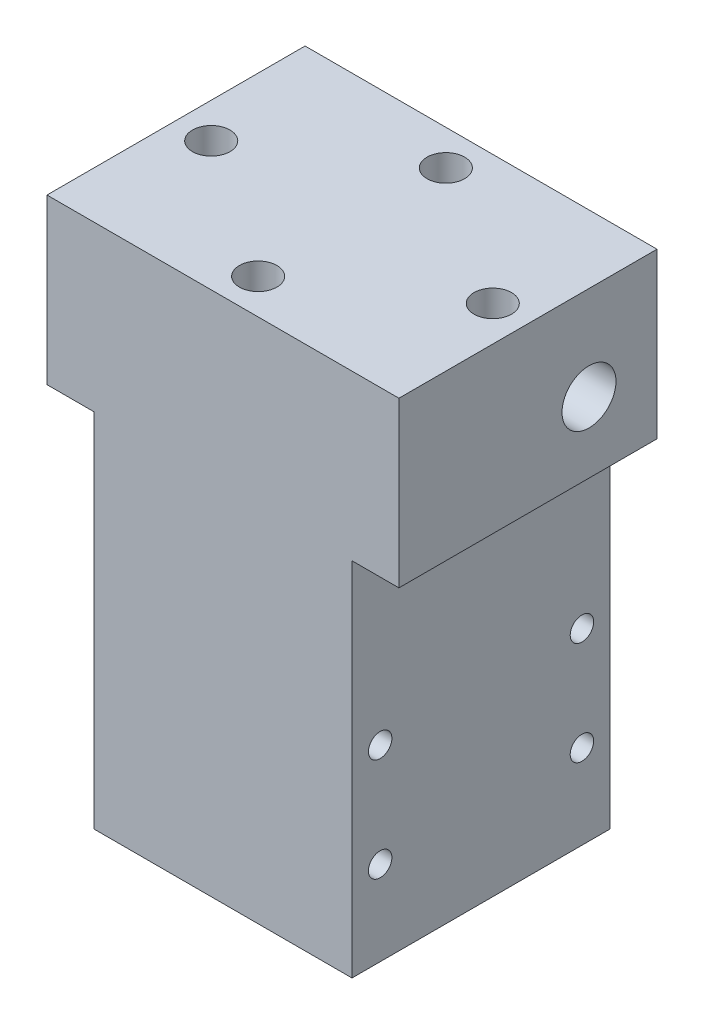
ISO-10303-21;
HEADER;
FILE_DESCRIPTION(('STEP AP214'),'2;1');
FILE_NAME('part.step','',(''),(''),'','','');
FILE_SCHEMA(('AUTOMOTIVE_DESIGN { 1 0 10303 214 1 1 1 1 }'));
ENDSEC;
DATA;
#1=APPLICATION_CONTEXT('core data for automotive mechanical design processes');
#2=APPLICATION_PROTOCOL_DEFINITION('international standard','automotive_design',2000,#1);
#3=PRODUCT_CONTEXT('',#1,'mechanical');
#4=PRODUCT('Part','Part','',(#3));
#5=PRODUCT_RELATED_PRODUCT_CATEGORY('part','',(#4));
#6=PRODUCT_DEFINITION_FORMATION('','',#4);
#7=PRODUCT_DEFINITION_CONTEXT('part definition',#1,'design');
#8=PRODUCT_DEFINITION('design','',#6,#7);
#9=PRODUCT_DEFINITION_SHAPE('','',#8);
#10=(LENGTH_UNIT() NAMED_UNIT(*) SI_UNIT(.MILLI.,.METRE.));
#11=(NAMED_UNIT(*) PLANE_ANGLE_UNIT() SI_UNIT($,.RADIAN.));
#12=(NAMED_UNIT(*) SI_UNIT($,.STERADIAN.) SOLID_ANGLE_UNIT());
#13=UNCERTAINTY_MEASURE_WITH_UNIT(LENGTH_MEASURE(1.E-05),#10,'distance_accuracy_value','');
#14=(GEOMETRIC_REPRESENTATION_CONTEXT(3) GLOBAL_UNCERTAINTY_ASSIGNED_CONTEXT((#13)) GLOBAL_UNIT_ASSIGNED_CONTEXT((#10,
#11,#12)) REPRESENTATION_CONTEXT('',''));
#15=CARTESIAN_POINT('',(0.,0.,0.));
#16=DIRECTION('',(0.,0.,1.));
#17=DIRECTION('',(1.,0.,0.));
#18=AXIS2_PLACEMENT_3D('',#15,#16,#17);
#19=CARTESIAN_POINT('',(37.5,-35.,-27.5));
#20=DIRECTION('',(1.,0.,0.));
#21=DIRECTION('',(0.,0.,-1.));
#22=AXIS2_PLACEMENT_3D('',#19,#20,#21);
#23=PLANE('',#22);
#24=CARTESIAN_POINT('',(37.5,-20.,-13.));
#25=DIRECTION('',(1.,0.,0.));
#26=DIRECTION('',(0.,0.,-1.));
#27=AXIS2_PLACEMENT_3D('',#24,#25,#26);
#28=CIRCLE('',#27,5.75);
#29=CARTESIAN_POINT('',(37.5,-20.,-18.75));
#30=VERTEX_POINT('',#29);
#31=EDGE_CURVE('E297',#30,#30,#28,.T.);
#32=ORIENTED_EDGE('',*,*,#31,.F.);
#33=EDGE_LOOP('',(#32));
#34=FACE_BOUND('',#33,.T.);
#35=DIRECTION('',(0.,0.,1.));
#36=VECTOR('',#35,1.);
#37=CARTESIAN_POINT('',(37.5,0.,-27.5));
#38=LINE('',#37,#36);
#39=CARTESIAN_POINT('',(37.5,0.,-27.5));
#40=VERTEX_POINT('',#39);
#41=CARTESIAN_POINT('',(37.5,0.,27.5));
#42=VERTEX_POINT('',#41);
#43=EDGE_CURVE('E36',#40,#42,#38,.T.);
#44=ORIENTED_EDGE('',*,*,#43,.T.);
#45=DIRECTION('',(0.,1.,0.));
#46=VECTOR('',#45,1.);
#47=CARTESIAN_POINT('',(37.5,-35.,27.5));
#48=LINE('',#47,#46);
#49=CARTESIAN_POINT('',(37.5,-35.,27.5));
#50=VERTEX_POINT('',#49);
#51=EDGE_CURVE('E97',#50,#42,#48,.T.);
#52=ORIENTED_EDGE('',*,*,#51,.F.);
#53=DIRECTION('',(0.,0.,1.));
#54=VECTOR('',#53,1.);
#55=CARTESIAN_POINT('',(37.5,-35.,-27.5));
#56=LINE('',#55,#54);
#57=CARTESIAN_POINT('',(37.5,-35.,-27.5));
#58=VERTEX_POINT('',#57);
#59=EDGE_CURVE('E11',#58,#50,#56,.T.);
#60=ORIENTED_EDGE('',*,*,#59,.F.);
#61=DIRECTION('',(0.,1.,0.));
#62=VECTOR('',#61,1.);
#63=CARTESIAN_POINT('',(37.5,-35.,-27.5));
#64=LINE('',#63,#62);
#65=EDGE_CURVE('E98',#58,#40,#64,.T.);
#66=ORIENTED_EDGE('',*,*,#65,.T.);
#67=EDGE_LOOP('',(#44,#52,#60,#66));
#68=FACE_BOUND('',#67,.T.);
#69=ADVANCED_FACE('F33',(#34,#68),#23,.T.);
#70=CARTESIAN_POINT('',(27.5,-35.,-27.5));
#71=DIRECTION('',(0.,-1.,0.));
#72=DIRECTION('',(0.,0.,-1.));
#73=AXIS2_PLACEMENT_3D('',#70,#71,#72);
#74=PLANE('',#73);
#75=ORIENTED_EDGE('',*,*,#59,.T.);
#76=DIRECTION('',(1.,0.,0.));
#77=VECTOR('',#76,1.);
#78=CARTESIAN_POINT('',(27.5,-35.,27.5));
#79=LINE('',#78,#77);
#80=CARTESIAN_POINT('',(27.5,-35.,27.5));
#81=VERTEX_POINT('',#80);
#82=EDGE_CURVE('E115',#81,#50,#79,.T.);
#83=ORIENTED_EDGE('',*,*,#82,.F.);
#84=DIRECTION('',(0.,0.,1.));
#85=VECTOR('',#84,1.);
#86=CARTESIAN_POINT('',(27.5,-35.,-27.5));
#87=LINE('',#86,#85);
#88=CARTESIAN_POINT('',(27.5,-35.,-27.5));
#89=VERTEX_POINT('',#88);
#90=EDGE_CURVE('E41',#89,#81,#87,.T.);
#91=ORIENTED_EDGE('',*,*,#90,.F.);
#92=DIRECTION('',(1.,0.,0.));
#93=VECTOR('',#92,1.);
#94=CARTESIAN_POINT('',(27.5,-35.,-27.5));
#95=LINE('',#94,#93);
#96=EDGE_CURVE('E103',#89,#58,#95,.T.);
#97=ORIENTED_EDGE('',*,*,#96,.T.);
#98=EDGE_LOOP('',(#75,#83,#91,#97));
#99=FACE_BOUND('',#98,.T.);
#100=ADVANCED_FACE('F184',(#99),#74,.T.);
#101=CARTESIAN_POINT('',(27.5,-112.,-27.5));
#102=DIRECTION('',(1.,0.,0.));
#103=DIRECTION('',(0.,1.,0.));
#104=AXIS2_PLACEMENT_3D('',#101,#102,#103);
#105=PLANE('',#104);
#106=CARTESIAN_POINT('',(27.5,-94.,-21.5));
#107=DIRECTION('',(1.,0.,0.));
#108=DIRECTION('',(0.,1.,0.));
#109=AXIS2_PLACEMENT_3D('',#106,#107,#108);
#110=CIRCLE('',#109,2.5);
#111=CARTESIAN_POINT('',(27.5,-91.5,-21.5));
#112=VERTEX_POINT('',#111);
#113=EDGE_CURVE('E261',#112,#112,#110,.T.);
#114=ORIENTED_EDGE('',*,*,#113,.F.);
#115=EDGE_LOOP('',(#114));
#116=FACE_BOUND('',#115,.T.);
#117=CARTESIAN_POINT('',(27.5,-72.,-21.5));
#118=DIRECTION('',(1.,0.,0.));
#119=DIRECTION('',(0.,1.,0.));
#120=AXIS2_PLACEMENT_3D('',#117,#118,#119);
#121=CIRCLE('',#120,2.5);
#122=CARTESIAN_POINT('',(27.5,-69.5,-21.5));
#123=VERTEX_POINT('',#122);
#124=EDGE_CURVE('E255',#123,#123,#121,.T.);
#125=ORIENTED_EDGE('',*,*,#124,.F.);
#126=EDGE_LOOP('',(#125));
#127=FACE_BOUND('',#126,.T.);
#128=CARTESIAN_POINT('',(27.5,-72.,21.5));
#129=DIRECTION('',(1.,0.,0.));
#130=DIRECTION('',(0.,1.,0.));
#131=AXIS2_PLACEMENT_3D('',#128,#129,#130);
#132=CIRCLE('',#131,2.5);
#133=CARTESIAN_POINT('',(27.5,-69.5,21.5));
#134=VERTEX_POINT('',#133);
#135=EDGE_CURVE('E249',#134,#134,#132,.T.);
#136=ORIENTED_EDGE('',*,*,#135,.F.);
#137=EDGE_LOOP('',(#136));
#138=FACE_BOUND('',#137,.T.);
#139=CARTESIAN_POINT('',(27.5,-94.,21.5));
#140=DIRECTION('',(1.,0.,0.));
#141=DIRECTION('',(0.,1.,0.));
#142=AXIS2_PLACEMENT_3D('',#139,#140,#141);
#143=CIRCLE('',#142,2.5);
#144=CARTESIAN_POINT('',(27.5,-91.5,21.5));
#145=VERTEX_POINT('',#144);
#146=EDGE_CURVE('E243',#145,#145,#143,.T.);
#147=ORIENTED_EDGE('',*,*,#146,.F.);
#148=EDGE_LOOP('',(#147));
#149=FACE_BOUND('',#148,.T.);
#150=ORIENTED_EDGE('',*,*,#90,.T.);
#151=DIRECTION('',(0.,1.,0.));
#152=VECTOR('',#151,1.);
#153=CARTESIAN_POINT('',(27.5,-112.,27.5));
#154=LINE('',#153,#152);
#155=CARTESIAN_POINT('',(27.5,-112.,27.5));
#156=VERTEX_POINT('',#155);
#157=EDGE_CURVE('E133',#156,#81,#154,.T.);
#158=ORIENTED_EDGE('',*,*,#157,.F.);
#159=DIRECTION('',(0.,0.,1.));
#160=VECTOR('',#159,1.);
#161=CARTESIAN_POINT('',(27.5,-112.,-27.5));
#162=LINE('',#161,#160);
#163=CARTESIAN_POINT('',(27.5,-112.,-27.5));
#164=VERTEX_POINT('',#163);
#165=EDGE_CURVE('E155',#164,#156,#162,.T.);
#166=ORIENTED_EDGE('',*,*,#165,.F.);
#167=DIRECTION('',(0.,1.,0.));
#168=VECTOR('',#167,1.);
#169=CARTESIAN_POINT('',(27.5,-112.,-27.5));
#170=LINE('',#169,#168);
#171=EDGE_CURVE('E151',#164,#89,#170,.T.);
#172=ORIENTED_EDGE('',*,*,#171,.T.);
#173=EDGE_LOOP('',(#150,#158,#166,#172));
#174=FACE_BOUND('',#173,.T.);
#175=ADVANCED_FACE('F183',(#116,#127,#138,#149,#174),#105,.T.);
#176=CARTESIAN_POINT('',(-27.5,-112.,-27.5));
#177=DIRECTION('',(0.,-1.,0.));
#178=DIRECTION('',(0.,0.,-1.));
#179=AXIS2_PLACEMENT_3D('',#176,#177,#178);
#180=PLANE('',#179);
#181=CARTESIAN_POINT('',(0.,-112.,0.));
#182=DIRECTION('',(0.,-1.,0.));
#183=DIRECTION('',(0.,0.,-1.));
#184=AXIS2_PLACEMENT_3D('',#181,#182,#183);
#185=CIRCLE('',#184,11.);
#186=CARTESIAN_POINT('',(0.,-112.,-11.));
#187=VERTEX_POINT('',#186);
#188=EDGE_CURVE('E291',#187,#187,#185,.T.);
#189=ORIENTED_EDGE('',*,*,#188,.F.);
#190=EDGE_LOOP('',(#189));
#191=FACE_BOUND('',#190,.T.);
#192=ORIENTED_EDGE('',*,*,#165,.T.);
#193=DIRECTION('',(1.,0.,0.));
#194=VECTOR('',#193,1.);
#195=CARTESIAN_POINT('',(-27.5,-112.,27.5));
#196=LINE('',#195,#194);
#197=CARTESIAN_POINT('',(-27.5,-112.,27.5));
#198=VERTEX_POINT('',#197);
#199=EDGE_CURVE('E130',#198,#156,#196,.T.);
#200=ORIENTED_EDGE('',*,*,#199,.F.);
#201=DIRECTION('',(0.,0.,1.));
#202=VECTOR('',#201,1.);
#203=CARTESIAN_POINT('',(-27.5,-112.,-27.5));
#204=LINE('',#203,#202);
#205=CARTESIAN_POINT('',(-27.5,-112.,-27.5));
#206=VERTEX_POINT('',#205);
#207=EDGE_CURVE('E157',#206,#198,#204,.T.);
#208=ORIENTED_EDGE('',*,*,#207,.F.);
#209=DIRECTION('',(1.,0.,0.));
#210=VECTOR('',#209,1.);
#211=CARTESIAN_POINT('',(-27.5,-112.,-27.5));
#212=LINE('',#211,#210);
#213=EDGE_CURVE('E148',#206,#164,#212,.T.);
#214=ORIENTED_EDGE('',*,*,#213,.T.);
#215=EDGE_LOOP('',(#192,#200,#208,#214));
#216=FACE_BOUND('',#215,.T.);
#217=ADVANCED_FACE('F179',(#191,#216),#180,.T.);
#218=CARTESIAN_POINT('',(-27.5,-35.,-27.5));
#219=DIRECTION('',(-1.,0.,0.));
#220=DIRECTION('',(0.,-1.,0.));
#221=AXIS2_PLACEMENT_3D('',#218,#219,#220);
#222=PLANE('',#221);
#223=CARTESIAN_POINT('',(-27.5,-94.,21.5));
#224=DIRECTION('',(-1.,0.,0.));
#225=DIRECTION('',(0.,-1.,0.));
#226=AXIS2_PLACEMENT_3D('',#223,#224,#225);
#227=CIRCLE('',#226,2.5);
#228=CARTESIAN_POINT('',(-27.5,-96.5,21.5));
#229=VERTEX_POINT('',#228);
#230=EDGE_CURVE('E285',#229,#229,#227,.T.);
#231=ORIENTED_EDGE('',*,*,#230,.F.);
#232=EDGE_LOOP('',(#231));
#233=FACE_BOUND('',#232,.T.);
#234=CARTESIAN_POINT('',(-27.5,-72.,21.5));
#235=DIRECTION('',(-1.,0.,0.));
#236=DIRECTION('',(0.,-1.,0.));
#237=AXIS2_PLACEMENT_3D('',#234,#235,#236);
#238=CIRCLE('',#237,2.5);
#239=CARTESIAN_POINT('',(-27.5,-74.5,21.5));
#240=VERTEX_POINT('',#239);
#241=EDGE_CURVE('E279',#240,#240,#238,.T.);
#242=ORIENTED_EDGE('',*,*,#241,.F.);
#243=EDGE_LOOP('',(#242));
#244=FACE_BOUND('',#243,.T.);
#245=CARTESIAN_POINT('',(-27.5,-72.,-21.5));
#246=DIRECTION('',(-1.,0.,0.));
#247=DIRECTION('',(0.,-1.,0.));
#248=AXIS2_PLACEMENT_3D('',#245,#246,#247);
#249=CIRCLE('',#248,2.5);
#250=CARTESIAN_POINT('',(-27.5,-74.5,-21.5));
#251=VERTEX_POINT('',#250);
#252=EDGE_CURVE('E273',#251,#251,#249,.T.);
#253=ORIENTED_EDGE('',*,*,#252,.F.);
#254=EDGE_LOOP('',(#253));
#255=FACE_BOUND('',#254,.T.);
#256=CARTESIAN_POINT('',(-27.5,-94.,-21.5));
#257=DIRECTION('',(-1.,0.,0.));
#258=DIRECTION('',(0.,-1.,0.));
#259=AXIS2_PLACEMENT_3D('',#256,#257,#258);
#260=CIRCLE('',#259,2.5);
#261=CARTESIAN_POINT('',(-27.5,-96.5,-21.5));
#262=VERTEX_POINT('',#261);
#263=EDGE_CURVE('E267',#262,#262,#260,.T.);
#264=ORIENTED_EDGE('',*,*,#263,.F.);
#265=EDGE_LOOP('',(#264));
#266=FACE_BOUND('',#265,.T.);
#267=ORIENTED_EDGE('',*,*,#207,.T.);
#268=DIRECTION('',(0.,-1.,0.));
#269=VECTOR('',#268,1.);
#270=CARTESIAN_POINT('',(-27.5,-35.,27.5));
#271=LINE('',#270,#269);
#272=CARTESIAN_POINT('',(-27.5,-35.,27.5));
#273=VERTEX_POINT('',#272);
#274=EDGE_CURVE('E127',#273,#198,#271,.T.);
#275=ORIENTED_EDGE('',*,*,#274,.F.);
#276=DIRECTION('',(0.,0.,1.));
#277=VECTOR('',#276,1.);
#278=CARTESIAN_POINT('',(-27.5,-35.,-27.5));
#279=LINE('',#278,#277);
#280=CARTESIAN_POINT('',(-27.5,-35.,-27.5));
#281=VERTEX_POINT('',#280);
#282=EDGE_CURVE('E159',#281,#273,#279,.T.);
#283=ORIENTED_EDGE('',*,*,#282,.F.);
#284=DIRECTION('',(0.,-1.,0.));
#285=VECTOR('',#284,1.);
#286=CARTESIAN_POINT('',(-27.5,-35.,-27.5));
#287=LINE('',#286,#285);
#288=EDGE_CURVE('E145',#281,#206,#287,.T.);
#289=ORIENTED_EDGE('',*,*,#288,.T.);
#290=EDGE_LOOP('',(#267,#275,#283,#289));
#291=FACE_BOUND('',#290,.T.);
#292=ADVANCED_FACE('F172',(#233,#244,#255,#266,#291),#222,.T.);
#293=CARTESIAN_POINT('',(-37.5,-35.,-27.5));
#294=DIRECTION('',(0.,-1.,0.));
#295=DIRECTION('',(0.,0.,-1.));
#296=AXIS2_PLACEMENT_3D('',#293,#294,#295);
#297=PLANE('',#296);
#298=ORIENTED_EDGE('',*,*,#282,.T.);
#299=DIRECTION('',(1.,0.,0.));
#300=VECTOR('',#299,1.);
#301=CARTESIAN_POINT('',(-37.5,-35.,27.5));
#302=LINE('',#301,#300);
#303=CARTESIAN_POINT('',(-37.5,-35.,27.5));
#304=VERTEX_POINT('',#303);
#305=EDGE_CURVE('E124',#304,#273,#302,.T.);
#306=ORIENTED_EDGE('',*,*,#305,.F.);
#307=DIRECTION('',(0.,0.,1.));
#308=VECTOR('',#307,1.);
#309=CARTESIAN_POINT('',(-37.5,-35.,-27.5));
#310=LINE('',#309,#308);
#311=CARTESIAN_POINT('',(-37.5,-35.,-27.5));
#312=VERTEX_POINT('',#311);
#313=EDGE_CURVE('E161',#312,#304,#310,.T.);
#314=ORIENTED_EDGE('',*,*,#313,.F.);
#315=DIRECTION('',(1.,0.,0.));
#316=VECTOR('',#315,1.);
#317=CARTESIAN_POINT('',(-37.5,-35.,-27.5));
#318=LINE('',#317,#316);
#319=EDGE_CURVE('E142',#312,#281,#318,.T.);
#320=ORIENTED_EDGE('',*,*,#319,.T.);
#321=EDGE_LOOP('',(#298,#306,#314,#320));
#322=FACE_BOUND('',#321,.T.);
#323=ADVANCED_FACE('F169',(#322),#297,.T.);
#324=CARTESIAN_POINT('',(-37.5,0.,-27.5));
#325=DIRECTION('',(-1.,0.,0.));
#326=DIRECTION('',(0.,0.,1.));
#327=AXIS2_PLACEMENT_3D('',#324,#325,#326);
#328=PLANE('',#327);
#329=CARTESIAN_POINT('',(-37.5,-20.,-13.));
#330=DIRECTION('',(-1.,0.,0.));
#331=DIRECTION('',(0.,0.,1.));
#332=AXIS2_PLACEMENT_3D('',#329,#330,#331);
#333=CIRCLE('',#332,5.75);
#334=CARTESIAN_POINT('',(-37.5,-20.,-7.25));
#335=VERTEX_POINT('',#334);
#336=EDGE_CURVE('E303',#335,#335,#333,.T.);
#337=ORIENTED_EDGE('',*,*,#336,.F.);
#338=EDGE_LOOP('',(#337));
#339=FACE_BOUND('',#338,.T.);
#340=ORIENTED_EDGE('',*,*,#313,.T.);
#341=DIRECTION('',(0.,-1.,0.));
#342=VECTOR('',#341,1.);
#343=CARTESIAN_POINT('',(-37.5,0.,27.5));
#344=LINE('',#343,#342);
#345=CARTESIAN_POINT('',(-37.5,0.,27.5));
#346=VERTEX_POINT('',#345);
#347=EDGE_CURVE('E110',#346,#304,#344,.T.);
#348=ORIENTED_EDGE('',*,*,#347,.F.);
#349=DIRECTION('',(0.,0.,1.));
#350=VECTOR('',#349,1.);
#351=CARTESIAN_POINT('',(-37.5,0.,-27.5));
#352=LINE('',#351,#350);
#353=CARTESIAN_POINT('',(-37.5,0.,-27.5));
#354=VERTEX_POINT('',#353);
#355=EDGE_CURVE('E102',#354,#346,#352,.T.);
#356=ORIENTED_EDGE('',*,*,#355,.F.);
#357=DIRECTION('',(0.,-1.,0.));
#358=VECTOR('',#357,1.);
#359=CARTESIAN_POINT('',(-37.5,0.,-27.5));
#360=LINE('',#359,#358);
#361=EDGE_CURVE('E139',#354,#312,#360,.T.);
#362=ORIENTED_EDGE('',*,*,#361,.T.);
#363=EDGE_LOOP('',(#340,#348,#356,#362));
#364=FACE_BOUND('',#363,.T.);
#365=ADVANCED_FACE('F163',(#339,#364),#328,.T.);
#366=CARTESIAN_POINT('',(37.5,0.,-27.5));
#367=DIRECTION('',(0.,1.,0.));
#368=DIRECTION('',(-1.,0.,0.));
#369=AXIS2_PLACEMENT_3D('',#366,#367,#368);
#370=PLANE('',#369);
#371=CARTESIAN_POINT('',(0.,0.,20.));
#372=DIRECTION('',(0.,1.,0.));
#373=DIRECTION('',(-1.,0.,0.));
#374=AXIS2_PLACEMENT_3D('',#371,#372,#373);
#375=CIRCLE('',#374,4.);
#376=CARTESIAN_POINT('',(-4.,0.,20.));
#377=VERTEX_POINT('',#376);
#378=EDGE_CURVE('E215',#377,#377,#375,.T.);
#379=ORIENTED_EDGE('',*,*,#378,.F.);
#380=EDGE_LOOP('',(#379));
#381=FACE_BOUND('',#380,.T.);
#382=CARTESIAN_POINT('',(30.,0.,0.));
#383=DIRECTION('',(0.,1.,0.));
#384=DIRECTION('',(-1.,0.,0.));
#385=AXIS2_PLACEMENT_3D('',#382,#383,#384);
#386=CIRCLE('',#385,4.00000000000001);
#387=CARTESIAN_POINT('',(26.,0.,0.));
#388=VERTEX_POINT('',#387);
#389=EDGE_CURVE('E219',#388,#388,#386,.T.);
#390=ORIENTED_EDGE('',*,*,#389,.F.);
#391=EDGE_LOOP('',(#390));
#392=FACE_BOUND('',#391,.T.);
#393=CARTESIAN_POINT('',(0.,0.,-20.));
#394=DIRECTION('',(0.,1.,0.));
#395=DIRECTION('',(-1.,0.,0.));
#396=AXIS2_PLACEMENT_3D('',#393,#394,#395);
#397=CIRCLE('',#396,4.);
#398=CARTESIAN_POINT('',(-4.,0.,-20.));
#399=VERTEX_POINT('',#398);
#400=EDGE_CURVE('E223',#399,#399,#397,.T.);
#401=ORIENTED_EDGE('',*,*,#400,.F.);
#402=EDGE_LOOP('',(#401));
#403=FACE_BOUND('',#402,.T.);
#404=CARTESIAN_POINT('',(-30.,0.,0.));
#405=DIRECTION('',(0.,1.,0.));
#406=DIRECTION('',(-1.,0.,0.));
#407=AXIS2_PLACEMENT_3D('',#404,#405,#406);
#408=CIRCLE('',#407,4.);
#409=CARTESIAN_POINT('',(-34.,0.,0.));
#410=VERTEX_POINT('',#409);
#411=EDGE_CURVE('E119',#410,#410,#408,.T.);
#412=ORIENTED_EDGE('',*,*,#411,.F.);
#413=EDGE_LOOP('',(#412));
#414=FACE_BOUND('',#413,.T.);
#415=ORIENTED_EDGE('',*,*,#355,.T.);
#416=DIRECTION('',(-1.,0.,0.));
#417=VECTOR('',#416,1.);
#418=CARTESIAN_POINT('',(37.5,0.,27.5));
#419=LINE('',#418,#417);
#420=EDGE_CURVE('E105',#42,#346,#419,.T.);
#421=ORIENTED_EDGE('',*,*,#420,.F.);
#422=ORIENTED_EDGE('',*,*,#43,.F.);
#423=DIRECTION('',(-1.,0.,0.));
#424=VECTOR('',#423,1.);
#425=CARTESIAN_POINT('',(37.5,0.,-27.5));
#426=LINE('',#425,#424);
#427=EDGE_CURVE('E137',#40,#354,#426,.T.);
#428=ORIENTED_EDGE('',*,*,#427,.T.);
#429=EDGE_LOOP('',(#415,#421,#422,#428));
#430=FACE_BOUND('',#429,.T.);
#431=ADVANCED_FACE('F106',(#381,#392,#403,#414,#430),#370,.T.);
#432=CARTESIAN_POINT('',(0.,0.,-27.5));
#433=DIRECTION('',(0.,0.,1.));
#434=DIRECTION('',(1.,0.,0.));
#435=AXIS2_PLACEMENT_3D('',#432,#433,#434);
#436=PLANE('',#435);
#437=ORIENTED_EDGE('',*,*,#65,.F.);
#438=ORIENTED_EDGE('',*,*,#96,.F.);
#439=ORIENTED_EDGE('',*,*,#171,.F.);
#440=ORIENTED_EDGE('',*,*,#213,.F.);
#441=ORIENTED_EDGE('',*,*,#288,.F.);
#442=ORIENTED_EDGE('',*,*,#319,.F.);
#443=ORIENTED_EDGE('',*,*,#361,.F.);
#444=ORIENTED_EDGE('',*,*,#427,.F.);
#445=EDGE_LOOP('',(#437,#438,#439,#440,#441,#442,#443,#444));
#446=FACE_BOUND('',#445,.T.);
#447=ADVANCED_FACE('F175',(#446),#436,.F.);
#448=CARTESIAN_POINT('',(0.,0.,27.5));
#449=DIRECTION('',(0.,0.,1.));
#450=DIRECTION('',(1.,0.,0.));
#451=AXIS2_PLACEMENT_3D('',#448,#449,#450);
#452=PLANE('',#451);
#453=ORIENTED_EDGE('',*,*,#51,.T.);
#454=ORIENTED_EDGE('',*,*,#420,.T.);
#455=ORIENTED_EDGE('',*,*,#347,.T.);
#456=ORIENTED_EDGE('',*,*,#305,.T.);
#457=ORIENTED_EDGE('',*,*,#274,.T.);
#458=ORIENTED_EDGE('',*,*,#199,.T.);
#459=ORIENTED_EDGE('',*,*,#157,.T.);
#460=ORIENTED_EDGE('',*,*,#82,.T.);
#461=EDGE_LOOP('',(#453,#454,#455,#456,#457,#458,#459,#460));
#462=FACE_BOUND('',#461,.T.);
#463=ADVANCED_FACE('F113',(#462),#452,.T.);
#464=CARTESIAN_POINT('',(-30.,-30.,0.));
#465=DIRECTION('',(0.,1.,0.));
#466=DIRECTION('',(-1.,0.,0.));
#467=AXIS2_PLACEMENT_3D('',#464,#465,#466);
#468=CYLINDRICAL_SURFACE('',#467,4.);
#469=CARTESIAN_POINT('',(-30.,-30.,0.));
#470=DIRECTION('',(0.,1.,0.));
#471=DIRECTION('',(-1.,0.,0.));
#472=AXIS2_PLACEMENT_3D('',#469,#470,#471);
#473=CIRCLE('',#472,4.);
#474=CARTESIAN_POINT('',(-34.,-30.,0.));
#475=VERTEX_POINT('',#474);
#476=EDGE_CURVE('E116',#475,#475,#473,.T.);
#477=ORIENTED_EDGE('',*,*,#476,.F.);
#478=EDGE_LOOP('',(#477));
#479=FACE_BOUND('',#478,.T.);
#480=ORIENTED_EDGE('',*,*,#411,.T.);
#481=EDGE_LOOP('',(#480));
#482=FACE_BOUND('',#481,.T.);
#483=ADVANCED_FACE('F430',(#479,#482),#468,.F.);
#484=CARTESIAN_POINT('',(-30.,-30.,0.));
#485=DIRECTION('',(0.,1.,0.));
#486=DIRECTION('',(-1.,0.,0.));
#487=AXIS2_PLACEMENT_3D('',#484,#485,#486);
#488=PLANE('',#487);
#489=ORIENTED_EDGE('',*,*,#476,.T.);
#490=EDGE_LOOP('',(#489));
#491=FACE_BOUND('',#490,.T.);
#492=ADVANCED_FACE('F426',(#491),#488,.T.);
#493=CARTESIAN_POINT('',(0.,-30.,-20.));
#494=DIRECTION('',(0.,1.,0.));
#495=DIRECTION('',(-1.,0.,0.));
#496=AXIS2_PLACEMENT_3D('',#493,#494,#495);
#497=CYLINDRICAL_SURFACE('',#496,4.);
#498=CARTESIAN_POINT('',(0.,-30.,-20.));
#499=DIRECTION('',(0.,1.,0.));
#500=DIRECTION('',(-1.,0.,0.));
#501=AXIS2_PLACEMENT_3D('',#498,#499,#500);
#502=CIRCLE('',#501,4.);
#503=CARTESIAN_POINT('',(-4.,-30.,-20.));
#504=VERTEX_POINT('',#503);
#505=EDGE_CURVE('E227',#504,#504,#502,.T.);
#506=ORIENTED_EDGE('',*,*,#505,.F.);
#507=EDGE_LOOP('',(#506));
#508=FACE_BOUND('',#507,.T.);
#509=ORIENTED_EDGE('',*,*,#400,.T.);
#510=EDGE_LOOP('',(#509));
#511=FACE_BOUND('',#510,.T.);
#512=ADVANCED_FACE('F423',(#508,#511),#497,.F.);
#513=CARTESIAN_POINT('',(0.,-30.,-20.));
#514=DIRECTION('',(0.,1.,0.));
#515=DIRECTION('',(-1.,0.,0.));
#516=AXIS2_PLACEMENT_3D('',#513,#514,#515);
#517=PLANE('',#516);
#518=ORIENTED_EDGE('',*,*,#505,.T.);
#519=EDGE_LOOP('',(#518));
#520=FACE_BOUND('',#519,.T.);
#521=ADVANCED_FACE('F419',(#520),#517,.T.);
#522=CARTESIAN_POINT('',(30.,-30.,0.));
#523=DIRECTION('',(0.,1.,0.));
#524=DIRECTION('',(-1.,0.,0.));
#525=AXIS2_PLACEMENT_3D('',#522,#523,#524);
#526=CYLINDRICAL_SURFACE('',#525,4.00000000000001);
#527=CARTESIAN_POINT('',(30.,-30.,0.));
#528=DIRECTION('',(0.,1.,0.));
#529=DIRECTION('',(-1.,0.,0.));
#530=AXIS2_PLACEMENT_3D('',#527,#528,#529);
#531=CIRCLE('',#530,4.00000000000001);
#532=CARTESIAN_POINT('',(26.,-30.,0.));
#533=VERTEX_POINT('',#532);
#534=EDGE_CURVE('E232',#533,#533,#531,.T.);
#535=ORIENTED_EDGE('',*,*,#534,.F.);
#536=EDGE_LOOP('',(#535));
#537=FACE_BOUND('',#536,.T.);
#538=ORIENTED_EDGE('',*,*,#389,.T.);
#539=EDGE_LOOP('',(#538));
#540=FACE_BOUND('',#539,.T.);
#541=ADVANCED_FACE('F415',(#537,#540),#526,.F.);
#542=CARTESIAN_POINT('',(30.,-30.,0.));
#543=DIRECTION('',(0.,1.,0.));
#544=DIRECTION('',(-1.,0.,0.));
#545=AXIS2_PLACEMENT_3D('',#542,#543,#544);
#546=PLANE('',#545);
#547=ORIENTED_EDGE('',*,*,#534,.T.);
#548=EDGE_LOOP('',(#547));
#549=FACE_BOUND('',#548,.T.);
#550=ADVANCED_FACE('F411',(#549),#546,.T.);
#551=CARTESIAN_POINT('',(0.,-30.,20.));
#552=DIRECTION('',(0.,1.,0.));
#553=DIRECTION('',(-1.,0.,0.));
#554=AXIS2_PLACEMENT_3D('',#551,#552,#553);
#555=CYLINDRICAL_SURFACE('',#554,4.);
#556=CARTESIAN_POINT('',(0.,-30.,20.));
#557=DIRECTION('',(0.,1.,0.));
#558=DIRECTION('',(-1.,0.,0.));
#559=AXIS2_PLACEMENT_3D('',#556,#557,#558);
#560=CIRCLE('',#559,4.);
#561=CARTESIAN_POINT('',(-4.,-30.,20.));
#562=VERTEX_POINT('',#561);
#563=EDGE_CURVE('E236',#562,#562,#560,.T.);
#564=ORIENTED_EDGE('',*,*,#563,.F.);
#565=EDGE_LOOP('',(#564));
#566=FACE_BOUND('',#565,.T.);
#567=ORIENTED_EDGE('',*,*,#378,.T.);
#568=EDGE_LOOP('',(#567));
#569=FACE_BOUND('',#568,.T.);
#570=ADVANCED_FACE('F407',(#566,#569),#555,.F.);
#571=CARTESIAN_POINT('',(0.,-30.,20.));
#572=DIRECTION('',(0.,1.,0.));
#573=DIRECTION('',(-1.,0.,0.));
#574=AXIS2_PLACEMENT_3D('',#571,#572,#573);
#575=PLANE('',#574);
#576=ORIENTED_EDGE('',*,*,#563,.T.);
#577=EDGE_LOOP('',(#576));
#578=FACE_BOUND('',#577,.T.);
#579=ADVANCED_FACE('F403',(#578),#575,.T.);
#580=CARTESIAN_POINT('',(5.50000000000001,-94.,21.5));
#581=DIRECTION('',(1.,0.,0.));
#582=DIRECTION('',(0.,1.,0.));
#583=AXIS2_PLACEMENT_3D('',#580,#581,#582);
#584=CYLINDRICAL_SURFACE('',#583,2.5);
#585=CARTESIAN_POINT('',(5.50000000000001,-94.,21.5));
#586=DIRECTION('',(1.,0.,0.));
#587=DIRECTION('',(0.,1.,0.));
#588=AXIS2_PLACEMENT_3D('',#585,#586,#587);
#589=CIRCLE('',#588,2.5);
#590=CARTESIAN_POINT('',(5.50000000000001,-91.5,21.5));
#591=VERTEX_POINT('',#590);
#592=EDGE_CURVE('E240',#591,#591,#589,.T.);
#593=ORIENTED_EDGE('',*,*,#592,.F.);
#594=EDGE_LOOP('',(#593));
#595=FACE_BOUND('',#594,.T.);
#596=ORIENTED_EDGE('',*,*,#146,.T.);
#597=EDGE_LOOP('',(#596));
#598=FACE_BOUND('',#597,.T.);
#599=ADVANCED_FACE('F399',(#595,#598),#584,.F.);
#600=CARTESIAN_POINT('',(5.50000000000001,-94.,21.5));
#601=DIRECTION('',(1.,0.,0.));
#602=DIRECTION('',(0.,1.,0.));
#603=AXIS2_PLACEMENT_3D('',#600,#601,#602);
#604=PLANE('',#603);
#605=ORIENTED_EDGE('',*,*,#592,.T.);
#606=EDGE_LOOP('',(#605));
#607=FACE_BOUND('',#606,.T.);
#608=ADVANCED_FACE('F395',(#607),#604,.T.);
#609=CARTESIAN_POINT('',(5.50000000000001,-72.,21.5));
#610=DIRECTION('',(1.,0.,0.));
#611=DIRECTION('',(0.,1.,0.));
#612=AXIS2_PLACEMENT_3D('',#609,#610,#611);
#613=CYLINDRICAL_SURFACE('',#612,2.5);
#614=CARTESIAN_POINT('',(5.50000000000001,-72.,21.5));
#615=DIRECTION('',(1.,0.,0.));
#616=DIRECTION('',(0.,1.,0.));
#617=AXIS2_PLACEMENT_3D('',#614,#615,#616);
#618=CIRCLE('',#617,2.5);
#619=CARTESIAN_POINT('',(5.50000000000001,-69.5,21.5));
#620=VERTEX_POINT('',#619);
#621=EDGE_CURVE('E246',#620,#620,#618,.T.);
#622=ORIENTED_EDGE('',*,*,#621,.F.);
#623=EDGE_LOOP('',(#622));
#624=FACE_BOUND('',#623,.T.);
#625=ORIENTED_EDGE('',*,*,#135,.T.);
#626=EDGE_LOOP('',(#625));
#627=FACE_BOUND('',#626,.T.);
#628=ADVANCED_FACE('F391',(#624,#627),#613,.F.);
#629=CARTESIAN_POINT('',(5.50000000000001,-72.,21.5));
#630=DIRECTION('',(1.,0.,0.));
#631=DIRECTION('',(0.,1.,0.));
#632=AXIS2_PLACEMENT_3D('',#629,#630,#631);
#633=PLANE('',#632);
#634=ORIENTED_EDGE('',*,*,#621,.T.);
#635=EDGE_LOOP('',(#634));
#636=FACE_BOUND('',#635,.T.);
#637=ADVANCED_FACE('F387',(#636),#633,.T.);
#638=CARTESIAN_POINT('',(5.50000000000001,-72.,-21.5));
#639=DIRECTION('',(1.,0.,0.));
#640=DIRECTION('',(0.,1.,0.));
#641=AXIS2_PLACEMENT_3D('',#638,#639,#640);
#642=CYLINDRICAL_SURFACE('',#641,2.5);
#643=CARTESIAN_POINT('',(5.50000000000001,-72.,-21.5));
#644=DIRECTION('',(1.,0.,0.));
#645=DIRECTION('',(0.,1.,0.));
#646=AXIS2_PLACEMENT_3D('',#643,#644,#645);
#647=CIRCLE('',#646,2.5);
#648=CARTESIAN_POINT('',(5.50000000000001,-69.5,-21.5));
#649=VERTEX_POINT('',#648);
#650=EDGE_CURVE('E252',#649,#649,#647,.T.);
#651=ORIENTED_EDGE('',*,*,#650,.F.);
#652=EDGE_LOOP('',(#651));
#653=FACE_BOUND('',#652,.T.);
#654=ORIENTED_EDGE('',*,*,#124,.T.);
#655=EDGE_LOOP('',(#654));
#656=FACE_BOUND('',#655,.T.);
#657=ADVANCED_FACE('F383',(#653,#656),#642,.F.);
#658=CARTESIAN_POINT('',(5.50000000000001,-72.,-21.5));
#659=DIRECTION('',(1.,0.,0.));
#660=DIRECTION('',(0.,1.,0.));
#661=AXIS2_PLACEMENT_3D('',#658,#659,#660);
#662=PLANE('',#661);
#663=ORIENTED_EDGE('',*,*,#650,.T.);
#664=EDGE_LOOP('',(#663));
#665=FACE_BOUND('',#664,.T.);
#666=ADVANCED_FACE('F379',(#665),#662,.T.);
#667=CARTESIAN_POINT('',(5.50000000000001,-94.,-21.5));
#668=DIRECTION('',(1.,0.,0.));
#669=DIRECTION('',(0.,1.,0.));
#670=AXIS2_PLACEMENT_3D('',#667,#668,#669);
#671=CYLINDRICAL_SURFACE('',#670,2.5);
#672=CARTESIAN_POINT('',(5.50000000000001,-94.,-21.5));
#673=DIRECTION('',(1.,0.,0.));
#674=DIRECTION('',(0.,1.,0.));
#675=AXIS2_PLACEMENT_3D('',#672,#673,#674);
#676=CIRCLE('',#675,2.5);
#677=CARTESIAN_POINT('',(5.50000000000001,-91.5,-21.5));
#678=VERTEX_POINT('',#677);
#679=EDGE_CURVE('E258',#678,#678,#676,.T.);
#680=ORIENTED_EDGE('',*,*,#679,.F.);
#681=EDGE_LOOP('',(#680));
#682=FACE_BOUND('',#681,.T.);
#683=ORIENTED_EDGE('',*,*,#113,.T.);
#684=EDGE_LOOP('',(#683));
#685=FACE_BOUND('',#684,.T.);
#686=ADVANCED_FACE('F375',(#682,#685),#671,.F.);
#687=CARTESIAN_POINT('',(5.50000000000001,-94.,-21.5));
#688=DIRECTION('',(1.,0.,0.));
#689=DIRECTION('',(0.,1.,0.));
#690=AXIS2_PLACEMENT_3D('',#687,#688,#689);
#691=PLANE('',#690);
#692=ORIENTED_EDGE('',*,*,#679,.T.);
#693=EDGE_LOOP('',(#692));
#694=FACE_BOUND('',#693,.T.);
#695=ADVANCED_FACE('F371',(#694),#691,.T.);
#696=CARTESIAN_POINT('',(-5.49999999999999,-94.,-21.5));
#697=DIRECTION('',(-1.,0.,0.));
#698=DIRECTION('',(0.,-1.,0.));
#699=AXIS2_PLACEMENT_3D('',#696,#697,#698);
#700=CYLINDRICAL_SURFACE('',#699,2.5);
#701=CARTESIAN_POINT('',(-5.49999999999999,-94.,-21.5));
#702=DIRECTION('',(-1.,0.,0.));
#703=DIRECTION('',(0.,-1.,0.));
#704=AXIS2_PLACEMENT_3D('',#701,#702,#703);
#705=CIRCLE('',#704,2.5);
#706=CARTESIAN_POINT('',(-5.49999999999999,-96.5,-21.5));
#707=VERTEX_POINT('',#706);
#708=EDGE_CURVE('E264',#707,#707,#705,.T.);
#709=ORIENTED_EDGE('',*,*,#708,.F.);
#710=EDGE_LOOP('',(#709));
#711=FACE_BOUND('',#710,.T.);
#712=ORIENTED_EDGE('',*,*,#263,.T.);
#713=EDGE_LOOP('',(#712));
#714=FACE_BOUND('',#713,.T.);
#715=ADVANCED_FACE('F367',(#711,#714),#700,.F.);
#716=CARTESIAN_POINT('',(-5.49999999999999,-94.,-21.5));
#717=DIRECTION('',(-1.,0.,0.));
#718=DIRECTION('',(0.,-1.,0.));
#719=AXIS2_PLACEMENT_3D('',#716,#717,#718);
#720=PLANE('',#719);
#721=ORIENTED_EDGE('',*,*,#708,.T.);
#722=EDGE_LOOP('',(#721));
#723=FACE_BOUND('',#722,.T.);
#724=ADVANCED_FACE('F363',(#723),#720,.T.);
#725=CARTESIAN_POINT('',(-5.49999999999999,-72.,-21.5));
#726=DIRECTION('',(-1.,0.,0.));
#727=DIRECTION('',(0.,-1.,0.));
#728=AXIS2_PLACEMENT_3D('',#725,#726,#727);
#729=CYLINDRICAL_SURFACE('',#728,2.5);
#730=CARTESIAN_POINT('',(-5.49999999999999,-72.,-21.5));
#731=DIRECTION('',(-1.,0.,0.));
#732=DIRECTION('',(0.,-1.,0.));
#733=AXIS2_PLACEMENT_3D('',#730,#731,#732);
#734=CIRCLE('',#733,2.5);
#735=CARTESIAN_POINT('',(-5.49999999999999,-74.5,-21.5));
#736=VERTEX_POINT('',#735);
#737=EDGE_CURVE('E270',#736,#736,#734,.T.);
#738=ORIENTED_EDGE('',*,*,#737,.F.);
#739=EDGE_LOOP('',(#738));
#740=FACE_BOUND('',#739,.T.);
#741=ORIENTED_EDGE('',*,*,#252,.T.);
#742=EDGE_LOOP('',(#741));
#743=FACE_BOUND('',#742,.T.);
#744=ADVANCED_FACE('F359',(#740,#743),#729,.F.);
#745=CARTESIAN_POINT('',(-5.49999999999999,-72.,-21.5));
#746=DIRECTION('',(-1.,0.,0.));
#747=DIRECTION('',(0.,-1.,0.));
#748=AXIS2_PLACEMENT_3D('',#745,#746,#747);
#749=PLANE('',#748);
#750=ORIENTED_EDGE('',*,*,#737,.T.);
#751=EDGE_LOOP('',(#750));
#752=FACE_BOUND('',#751,.T.);
#753=ADVANCED_FACE('F355',(#752),#749,.T.);
#754=CARTESIAN_POINT('',(-5.49999999999999,-72.,21.5));
#755=DIRECTION('',(-1.,0.,0.));
#756=DIRECTION('',(0.,-1.,0.));
#757=AXIS2_PLACEMENT_3D('',#754,#755,#756);
#758=CYLINDRICAL_SURFACE('',#757,2.5);
#759=CARTESIAN_POINT('',(-5.49999999999999,-72.,21.5));
#760=DIRECTION('',(-1.,0.,0.));
#761=DIRECTION('',(0.,-1.,0.));
#762=AXIS2_PLACEMENT_3D('',#759,#760,#761);
#763=CIRCLE('',#762,2.5);
#764=CARTESIAN_POINT('',(-5.49999999999999,-74.5,21.5));
#765=VERTEX_POINT('',#764);
#766=EDGE_CURVE('E276',#765,#765,#763,.T.);
#767=ORIENTED_EDGE('',*,*,#766,.F.);
#768=EDGE_LOOP('',(#767));
#769=FACE_BOUND('',#768,.T.);
#770=ORIENTED_EDGE('',*,*,#241,.T.);
#771=EDGE_LOOP('',(#770));
#772=FACE_BOUND('',#771,.T.);
#773=ADVANCED_FACE('F351',(#769,#772),#758,.F.);
#774=CARTESIAN_POINT('',(-5.49999999999999,-72.,21.5));
#775=DIRECTION('',(-1.,0.,0.));
#776=DIRECTION('',(0.,-1.,0.));
#777=AXIS2_PLACEMENT_3D('',#774,#775,#776);
#778=PLANE('',#777);
#779=ORIENTED_EDGE('',*,*,#766,.T.);
#780=EDGE_LOOP('',(#779));
#781=FACE_BOUND('',#780,.T.);
#782=ADVANCED_FACE('F347',(#781),#778,.T.);
#783=CARTESIAN_POINT('',(-5.49999999999999,-94.,21.5));
#784=DIRECTION('',(-1.,0.,0.));
#785=DIRECTION('',(0.,-1.,0.));
#786=AXIS2_PLACEMENT_3D('',#783,#784,#785);
#787=CYLINDRICAL_SURFACE('',#786,2.5);
#788=CARTESIAN_POINT('',(-5.49999999999999,-94.,21.5));
#789=DIRECTION('',(-1.,0.,0.));
#790=DIRECTION('',(0.,-1.,0.));
#791=AXIS2_PLACEMENT_3D('',#788,#789,#790);
#792=CIRCLE('',#791,2.5);
#793=CARTESIAN_POINT('',(-5.49999999999999,-96.5,21.5));
#794=VERTEX_POINT('',#793);
#795=EDGE_CURVE('E282',#794,#794,#792,.T.);
#796=ORIENTED_EDGE('',*,*,#795,.F.);
#797=EDGE_LOOP('',(#796));
#798=FACE_BOUND('',#797,.T.);
#799=ORIENTED_EDGE('',*,*,#230,.T.);
#800=EDGE_LOOP('',(#799));
#801=FACE_BOUND('',#800,.T.);
#802=ADVANCED_FACE('F340',(#798,#801),#787,.F.);
#803=CARTESIAN_POINT('',(-5.49999999999999,-94.,21.5));
#804=DIRECTION('',(-1.,0.,0.));
#805=DIRECTION('',(0.,-1.,0.));
#806=AXIS2_PLACEMENT_3D('',#803,#804,#805);
#807=PLANE('',#806);
#808=ORIENTED_EDGE('',*,*,#795,.T.);
#809=EDGE_LOOP('',(#808));
#810=FACE_BOUND('',#809,.T.);
#811=ADVANCED_FACE('F334',(#810),#807,.T.);
#812=CARTESIAN_POINT('',(0.,-110.,0.));
#813=DIRECTION('',(0.,-1.,0.));
#814=DIRECTION('',(0.,0.,-1.));
#815=AXIS2_PLACEMENT_3D('',#812,#813,#814);
#816=CYLINDRICAL_SURFACE('',#815,11.);
#817=CARTESIAN_POINT('',(0.,-110.,0.));
#818=DIRECTION('',(0.,-1.,0.));
#819=DIRECTION('',(0.,0.,-1.));
#820=AXIS2_PLACEMENT_3D('',#817,#818,#819);
#821=CIRCLE('',#820,11.);
#822=CARTESIAN_POINT('',(0.,-110.,-11.));
#823=VERTEX_POINT('',#822);
#824=EDGE_CURVE('E288',#823,#823,#821,.T.);
#825=ORIENTED_EDGE('',*,*,#824,.F.);
#826=EDGE_LOOP('',(#825));
#827=FACE_BOUND('',#826,.T.);
#828=ORIENTED_EDGE('',*,*,#188,.T.);
#829=EDGE_LOOP('',(#828));
#830=FACE_BOUND('',#829,.T.);
#831=ADVANCED_FACE('F328',(#827,#830),#816,.F.);
#832=CARTESIAN_POINT('',(0.,-110.,0.));
#833=DIRECTION('',(0.,-1.,0.));
#834=DIRECTION('',(0.,0.,-1.));
#835=AXIS2_PLACEMENT_3D('',#832,#833,#834);
#836=PLANE('',#835);
#837=CARTESIAN_POINT('',(0.,-110.,0.));
#838=DIRECTION('',(0.,-1.,0.));
#839=DIRECTION('',(0.,0.,-1.));
#840=AXIS2_PLACEMENT_3D('',#837,#838,#839);
#841=CIRCLE('',#840,3.);
#842=CARTESIAN_POINT('',(0.,-110.,-3.));
#843=VERTEX_POINT('',#842);
#844=EDGE_CURVE('E309',#843,#843,#841,.T.);
#845=ORIENTED_EDGE('',*,*,#844,.F.);
#846=EDGE_LOOP('',(#845));
#847=FACE_BOUND('',#846,.T.);
#848=ORIENTED_EDGE('',*,*,#824,.T.);
#849=EDGE_LOOP('',(#848));
#850=FACE_BOUND('',#849,.T.);
#851=ADVANCED_FACE('F324',(#847,#850),#836,.T.);
#852=CARTESIAN_POINT('',(17.5,-20.,-13.));
#853=DIRECTION('',(1.,0.,0.));
#854=DIRECTION('',(0.,0.,-1.));
#855=AXIS2_PLACEMENT_3D('',#852,#853,#854);
#856=CYLINDRICAL_SURFACE('',#855,5.75);
#857=CARTESIAN_POINT('',(17.5,-20.,-13.));
#858=DIRECTION('',(1.,0.,0.));
#859=DIRECTION('',(0.,0.,-1.));
#860=AXIS2_PLACEMENT_3D('',#857,#858,#859);
#861=CIRCLE('',#860,5.75);
#862=CARTESIAN_POINT('',(17.5,-20.,-18.75));
#863=VERTEX_POINT('',#862);
#864=EDGE_CURVE('E294',#863,#863,#861,.T.);
#865=ORIENTED_EDGE('',*,*,#864,.F.);
#866=EDGE_LOOP('',(#865));
#867=FACE_BOUND('',#866,.T.);
#868=ORIENTED_EDGE('',*,*,#31,.T.);
#869=EDGE_LOOP('',(#868));
#870=FACE_BOUND('',#869,.T.);
#871=ADVANCED_FACE('F327',(#867,#870),#856,.F.);
#872=CARTESIAN_POINT('',(17.5,-20.,-13.));
#873=DIRECTION('',(1.,0.,0.));
#874=DIRECTION('',(0.,0.,-1.));
#875=AXIS2_PLACEMENT_3D('',#872,#873,#874);
#876=PLANE('',#875);
#877=ORIENTED_EDGE('',*,*,#864,.T.);
#878=EDGE_LOOP('',(#877));
#879=FACE_BOUND('',#878,.T.);
#880=ADVANCED_FACE('F566',(#879),#876,.T.);
#881=CARTESIAN_POINT('',(-17.5,-20.,-13.));
#882=DIRECTION('',(-1.,0.,0.));
#883=DIRECTION('',(0.,0.,1.));
#884=AXIS2_PLACEMENT_3D('',#881,#882,#883);
#885=CYLINDRICAL_SURFACE('',#884,5.75);
#886=CARTESIAN_POINT('',(-17.5,-20.,-13.));
#887=DIRECTION('',(-1.,0.,0.));
#888=DIRECTION('',(0.,0.,1.));
#889=AXIS2_PLACEMENT_3D('',#886,#887,#888);
#890=CIRCLE('',#889,5.75);
#891=CARTESIAN_POINT('',(-17.5,-20.,-7.25));
#892=VERTEX_POINT('',#891);
#893=EDGE_CURVE('E300',#892,#892,#890,.T.);
#894=ORIENTED_EDGE('',*,*,#893,.F.);
#895=EDGE_LOOP('',(#894));
#896=FACE_BOUND('',#895,.T.);
#897=ORIENTED_EDGE('',*,*,#336,.T.);
#898=EDGE_LOOP('',(#897));
#899=FACE_BOUND('',#898,.T.);
#900=ADVANCED_FACE('F575',(#896,#899),#885,.F.);
#901=CARTESIAN_POINT('',(-17.5,-20.,-13.));
#902=DIRECTION('',(-1.,0.,0.));
#903=DIRECTION('',(0.,0.,1.));
#904=AXIS2_PLACEMENT_3D('',#901,#902,#903);
#905=PLANE('',#904);
#906=ORIENTED_EDGE('',*,*,#893,.T.);
#907=EDGE_LOOP('',(#906));
#908=FACE_BOUND('',#907,.T.);
#909=ADVANCED_FACE('F320',(#908),#905,.T.);
#910=CARTESIAN_POINT('',(0.,-80.,0.));
#911=DIRECTION('',(0.,-1.,0.));
#912=DIRECTION('',(0.,0.,-1.));
#913=AXIS2_PLACEMENT_3D('',#910,#911,#912);
#914=CYLINDRICAL_SURFACE('',#913,3.);
#915=CARTESIAN_POINT('',(0.,-80.,0.));
#916=DIRECTION('',(0.,-1.,0.));
#917=DIRECTION('',(0.,0.,-1.));
#918=AXIS2_PLACEMENT_3D('',#915,#916,#917);
#919=CIRCLE('',#918,3.);
#920=CARTESIAN_POINT('',(0.,-80.,-3.));
#921=VERTEX_POINT('',#920);
#922=EDGE_CURVE('E306',#921,#921,#919,.T.);
#923=ORIENTED_EDGE('',*,*,#922,.F.);
#924=EDGE_LOOP('',(#923));
#925=FACE_BOUND('',#924,.T.);
#926=ORIENTED_EDGE('',*,*,#844,.T.);
#927=EDGE_LOOP('',(#926));
#928=FACE_BOUND('',#927,.T.);
#929=ADVANCED_FACE('F317',(#925,#928),#914,.F.);
#930=CARTESIAN_POINT('',(0.,-80.,0.));
#931=DIRECTION('',(0.,-1.,0.));
#932=DIRECTION('',(0.,0.,-1.));
#933=AXIS2_PLACEMENT_3D('',#930,#931,#932);
#934=PLANE('',#933);
#935=ORIENTED_EDGE('',*,*,#922,.T.);
#936=EDGE_LOOP('',(#935));
#937=FACE_BOUND('',#936,.T.);
#938=ADVANCED_FACE('F315',(#937),#934,.T.);
#939=CLOSED_SHELL('',(#69,#100,#175,#217,#292,#323,#365,#431,#447,#463,#483,#492,#512,#521,#541,
#550,#570,#579,#599,#608,#628,#637,#657,#666,#686,#695,#715,#724,#744,#753,#773,#782,#802,#811,
#831,#851,#871,#880,#900,#909,#929,#938));
#940=MANIFOLD_SOLID_BREP('B2',#939);
#941=ADVANCED_BREP_SHAPE_REPRESENTATION('',(#18,#940),#14);
#942=SHAPE_DEFINITION_REPRESENTATION(#9,#941);
ENDSEC;
END-ISO-10303-21;
